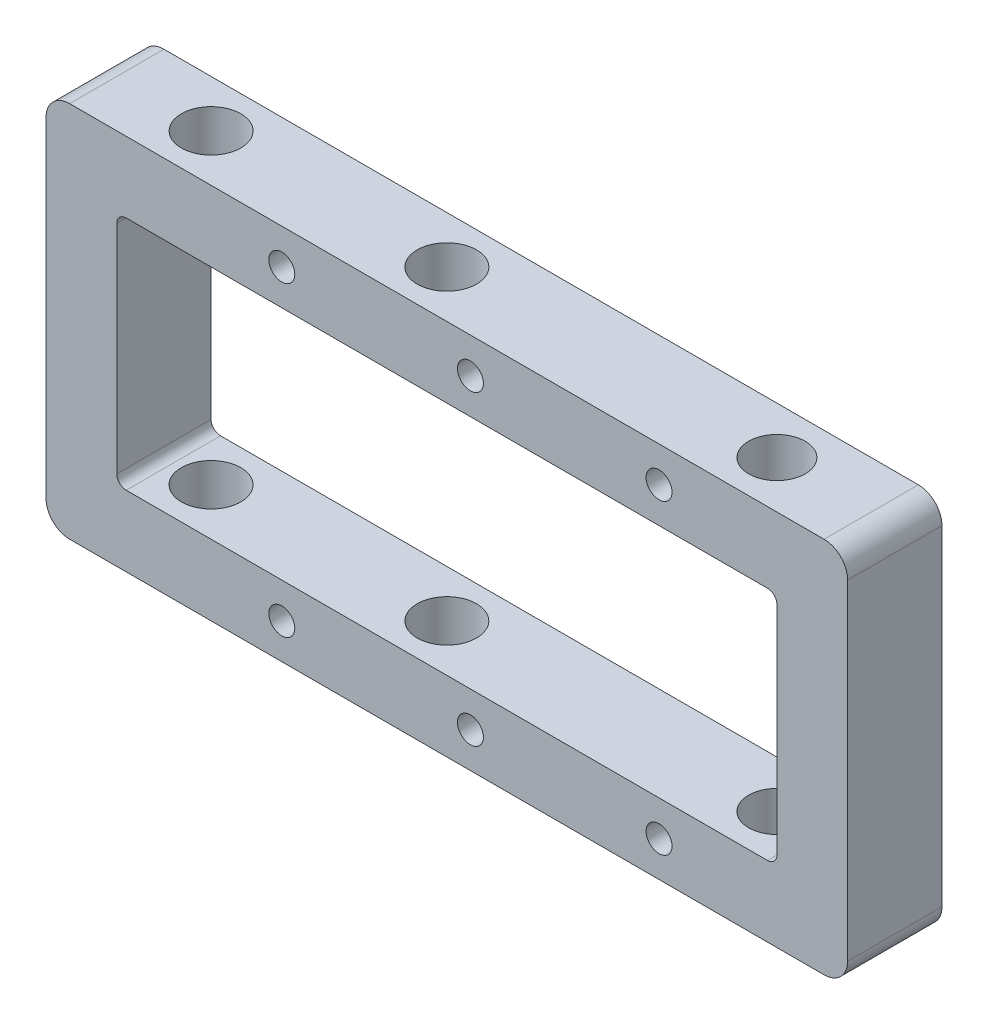
ISO-10303-21;
HEADER;
FILE_DESCRIPTION(('STEP AP214'),'2;1');
FILE_NAME('part.step','',(''),(''),'','','');
FILE_SCHEMA(('AUTOMOTIVE_DESIGN { 1 0 10303 214 1 1 1 1 }'));
ENDSEC;
DATA;
#1=APPLICATION_CONTEXT('core data for automotive mechanical design processes');
#2=APPLICATION_PROTOCOL_DEFINITION('international standard','automotive_design',2000,#1);
#3=PRODUCT_CONTEXT('',#1,'mechanical');
#4=PRODUCT('Part','Part','',(#3));
#5=PRODUCT_RELATED_PRODUCT_CATEGORY('part','',(#4));
#6=PRODUCT_DEFINITION_FORMATION('','',#4);
#7=PRODUCT_DEFINITION_CONTEXT('part definition',#1,'design');
#8=PRODUCT_DEFINITION('design','',#6,#7);
#9=PRODUCT_DEFINITION_SHAPE('','',#8);
#10=(LENGTH_UNIT() NAMED_UNIT(*) SI_UNIT(.MILLI.,.METRE.));
#11=(NAMED_UNIT(*) PLANE_ANGLE_UNIT() SI_UNIT($,.RADIAN.));
#12=(NAMED_UNIT(*) SI_UNIT($,.STERADIAN.) SOLID_ANGLE_UNIT());
#13=UNCERTAINTY_MEASURE_WITH_UNIT(LENGTH_MEASURE(1.E-05),#10,'distance_accuracy_value','');
#14=(GEOMETRIC_REPRESENTATION_CONTEXT(3) GLOBAL_UNCERTAINTY_ASSIGNED_CONTEXT((#13)) GLOBAL_UNIT_ASSIGNED_CONTEXT((#10,
#11,#12)) REPRESENTATION_CONTEXT('',''));
#15=CARTESIAN_POINT('',(0.,0.,0.));
#16=DIRECTION('',(0.,0.,1.));
#17=DIRECTION('',(1.,0.,0.));
#18=AXIS2_PLACEMENT_3D('',#15,#16,#17);
#19=CARTESIAN_POINT('',(0.,0.,20.));
#20=DIRECTION('',(0.,0.,1.));
#21=DIRECTION('',(1.,0.,0.));
#22=AXIS2_PLACEMENT_3D('',#19,#20,#21);
#23=PLANE('',#22);
#24=CARTESIAN_POINT('',(45.,32.5,20.));
#25=DIRECTION('',(0.,0.,-1.));
#26=DIRECTION('',(-1.,0.,0.));
#27=AXIS2_PLACEMENT_3D('',#24,#25,#26);
#28=CIRCLE('',#27,2.75);
#29=CARTESIAN_POINT('',(42.25,32.5,20.));
#30=VERTEX_POINT('',#29);
#31=EDGE_CURVE('E677',#30,#30,#28,.T.);
#32=ORIENTED_EDGE('',*,*,#31,.T.);
#33=EDGE_LOOP('',(#32));
#34=FACE_BOUND('',#33,.T.);
#35=CARTESIAN_POINT('',(45.,-32.5,20.));
#36=DIRECTION('',(0.,0.,-1.));
#37=DIRECTION('',(-1.,0.,0.));
#38=AXIS2_PLACEMENT_3D('',#35,#36,#37);
#39=CIRCLE('',#38,2.75);
#40=CARTESIAN_POINT('',(42.25,-32.5,20.));
#41=VERTEX_POINT('',#40);
#42=EDGE_CURVE('E683',#41,#41,#39,.T.);
#43=ORIENTED_EDGE('',*,*,#42,.T.);
#44=EDGE_LOOP('',(#43));
#45=FACE_BOUND('',#44,.T.);
#46=CARTESIAN_POINT('',(-35.,-32.5,20.));
#47=DIRECTION('',(0.,0.,1.));
#48=DIRECTION('',(1.,0.,0.));
#49=AXIS2_PLACEMENT_3D('',#46,#47,#48);
#50=CIRCLE('',#49,2.75);
#51=CARTESIAN_POINT('',(-32.25,-32.5,20.));
#52=VERTEX_POINT('',#51);
#53=EDGE_CURVE('E660',#52,#52,#50,.F.);
#54=ORIENTED_EDGE('',*,*,#53,.T.);
#55=EDGE_LOOP('',(#54));
#56=FACE_BOUND('',#55,.T.);
#57=CARTESIAN_POINT('',(4.99999999999999,32.5,20.));
#58=DIRECTION('',(0.,0.,1.));
#59=DIRECTION('',(1.,0.,0.));
#60=AXIS2_PLACEMENT_3D('',#57,#58,#59);
#61=CIRCLE('',#60,2.75);
#62=CARTESIAN_POINT('',(7.74999999999999,32.5,20.));
#63=VERTEX_POINT('',#62);
#64=EDGE_CURVE('E653',#63,#63,#61,.F.);
#65=ORIENTED_EDGE('',*,*,#64,.T.);
#66=EDGE_LOOP('',(#65));
#67=FACE_BOUND('',#66,.T.);
#68=CARTESIAN_POINT('',(4.99999999999999,-32.5,20.));
#69=DIRECTION('',(0.,0.,1.));
#70=DIRECTION('',(1.,0.,0.));
#71=AXIS2_PLACEMENT_3D('',#68,#69,#70);
#72=CIRCLE('',#71,2.75);
#73=CARTESIAN_POINT('',(7.74999999999999,-32.5,20.));
#74=VERTEX_POINT('',#73);
#75=EDGE_CURVE('E665',#74,#74,#72,.F.);
#76=ORIENTED_EDGE('',*,*,#75,.T.);
#77=EDGE_LOOP('',(#76));
#78=FACE_BOUND('',#77,.T.);
#79=CARTESIAN_POINT('',(-35.,32.5,20.));
#80=DIRECTION('',(0.,0.,1.));
#81=DIRECTION('',(1.,0.,0.));
#82=AXIS2_PLACEMENT_3D('',#79,#80,#81);
#83=CIRCLE('',#82,2.75);
#84=CARTESIAN_POINT('',(-32.25,32.5,20.));
#85=VERTEX_POINT('',#84);
#86=EDGE_CURVE('E292',#85,#85,#83,.F.);
#87=ORIENTED_EDGE('',*,*,#86,.T.);
#88=EDGE_LOOP('',(#87));
#89=FACE_BOUND('',#88,.T.);
#90=DIRECTION('',(-1.,0.,0.));
#91=VECTOR('',#90,1.);
#92=CARTESIAN_POINT('',(-85.,40.,20.));
#93=LINE('',#92,#91);
#94=CARTESIAN_POINT('',(80.,40.,20.));
#95=VERTEX_POINT('',#94);
#96=CARTESIAN_POINT('',(-80.,40.,20.));
#97=VERTEX_POINT('',#96);
#98=EDGE_CURVE('E255',#95,#97,#93,.T.);
#99=ORIENTED_EDGE('',*,*,#98,.T.);
#100=CARTESIAN_POINT('',(-80.,35.,20.));
#101=DIRECTION('',(0.,0.,1.));
#102=DIRECTION('',(1.,0.,0.));
#103=AXIS2_PLACEMENT_3D('',#100,#101,#102);
#104=CIRCLE('',#103,5.);
#105=CARTESIAN_POINT('',(-85.,35.,20.));
#106=VERTEX_POINT('',#105);
#107=EDGE_CURVE('E233',#97,#106,#104,.T.);
#108=ORIENTED_EDGE('',*,*,#107,.T.);
#109=DIRECTION('',(0.,-1.,0.));
#110=VECTOR('',#109,1.);
#111=CARTESIAN_POINT('',(-85.,40.,20.));
#112=LINE('',#111,#110);
#113=CARTESIAN_POINT('',(-85.,-35.,20.));
#114=VERTEX_POINT('',#113);
#115=EDGE_CURVE('E179',#106,#114,#112,.T.);
#116=ORIENTED_EDGE('',*,*,#115,.T.);
#117=CARTESIAN_POINT('',(-80.,-35.,20.));
#118=DIRECTION('',(0.,0.,1.));
#119=DIRECTION('',(1.,0.,0.));
#120=AXIS2_PLACEMENT_3D('',#117,#118,#119);
#121=CIRCLE('',#120,5.);
#122=CARTESIAN_POINT('',(-80.,-40.,20.));
#123=VERTEX_POINT('',#122);
#124=EDGE_CURVE('E56',#114,#123,#121,.T.);
#125=ORIENTED_EDGE('',*,*,#124,.T.);
#126=DIRECTION('',(1.,0.,0.));
#127=VECTOR('',#126,1.);
#128=CARTESIAN_POINT('',(-85.,-40.,20.));
#129=LINE('',#128,#127);
#130=CARTESIAN_POINT('',(80.,-40.,20.));
#131=VERTEX_POINT('',#130);
#132=EDGE_CURVE('E175',#123,#131,#129,.T.);
#133=ORIENTED_EDGE('',*,*,#132,.T.);
#134=CARTESIAN_POINT('',(80.,-35.,20.));
#135=DIRECTION('',(0.,0.,1.));
#136=DIRECTION('',(1.,0.,0.));
#137=AXIS2_PLACEMENT_3D('',#134,#135,#136);
#138=CIRCLE('',#137,5.);
#139=CARTESIAN_POINT('',(85.,-35.,20.));
#140=VERTEX_POINT('',#139);
#141=EDGE_CURVE('E230',#131,#140,#138,.T.);
#142=ORIENTED_EDGE('',*,*,#141,.T.);
#143=DIRECTION('',(0.,1.,0.));
#144=VECTOR('',#143,1.);
#145=CARTESIAN_POINT('',(85.,40.,20.));
#146=LINE('',#145,#144);
#147=CARTESIAN_POINT('',(85.,35.,20.));
#148=VERTEX_POINT('',#147);
#149=EDGE_CURVE('E245',#140,#148,#146,.T.);
#150=ORIENTED_EDGE('',*,*,#149,.T.);
#151=CARTESIAN_POINT('',(80.,35.,20.));
#152=DIRECTION('',(0.,0.,1.));
#153=DIRECTION('',(1.,0.,0.));
#154=AXIS2_PLACEMENT_3D('',#151,#152,#153);
#155=CIRCLE('',#154,5.);
#156=EDGE_CURVE('E228',#148,#95,#155,.T.);
#157=ORIENTED_EDGE('',*,*,#156,.T.);
#158=EDGE_LOOP('',(#99,#108,#116,#125,#133,#142,#150,#157));
#159=FACE_BOUND('',#158,.T.);
#160=DIRECTION('',(-1.,0.,0.));
#161=VECTOR('',#160,1.);
#162=CARTESIAN_POINT('',(-70.,25.,20.));
#163=LINE('',#162,#161);
#164=CARTESIAN_POINT('',(68.,25.,20.));
#165=VERTEX_POINT('',#164);
#166=CARTESIAN_POINT('',(-68.,25.,20.));
#167=VERTEX_POINT('',#166);
#168=EDGE_CURVE('E306',#165,#167,#163,.T.);
#169=ORIENTED_EDGE('',*,*,#168,.F.);
#170=CARTESIAN_POINT('',(68.,23.,20.));
#171=DIRECTION('',(0.,0.,1.));
#172=DIRECTION('',(1.,0.,0.));
#173=AXIS2_PLACEMENT_3D('',#170,#171,#172);
#174=CIRCLE('',#173,2.);
#175=CARTESIAN_POINT('',(70.,23.,20.));
#176=VERTEX_POINT('',#175);
#177=EDGE_CURVE('E160',#165,#176,#174,.F.);
#178=ORIENTED_EDGE('',*,*,#177,.T.);
#179=DIRECTION('',(0.,1.,0.));
#180=VECTOR('',#179,1.);
#181=CARTESIAN_POINT('',(70.,25.,20.));
#182=LINE('',#181,#180);
#183=CARTESIAN_POINT('',(70.,-23.,20.));
#184=VERTEX_POINT('',#183);
#185=EDGE_CURVE('E303',#184,#176,#182,.T.);
#186=ORIENTED_EDGE('',*,*,#185,.F.);
#187=CARTESIAN_POINT('',(68.,-23.,20.));
#188=DIRECTION('',(0.,0.,1.));
#189=DIRECTION('',(1.,0.,0.));
#190=AXIS2_PLACEMENT_3D('',#187,#188,#189);
#191=CIRCLE('',#190,2.);
#192=CARTESIAN_POINT('',(68.,-25.,20.));
#193=VERTEX_POINT('',#192);
#194=EDGE_CURVE('E161',#184,#193,#191,.F.);
#195=ORIENTED_EDGE('',*,*,#194,.T.);
#196=DIRECTION('',(1.,0.,0.));
#197=VECTOR('',#196,1.);
#198=CARTESIAN_POINT('',(-70.,-25.,20.));
#199=LINE('',#198,#197);
#200=CARTESIAN_POINT('',(-68.,-25.,20.));
#201=VERTEX_POINT('',#200);
#202=EDGE_CURVE('E271',#201,#193,#199,.T.);
#203=ORIENTED_EDGE('',*,*,#202,.F.);
#204=CARTESIAN_POINT('',(-68.,-23.,20.));
#205=DIRECTION('',(0.,0.,1.));
#206=DIRECTION('',(1.,0.,0.));
#207=AXIS2_PLACEMENT_3D('',#204,#205,#206);
#208=CIRCLE('',#207,2.);
#209=CARTESIAN_POINT('',(-70.,-23.,20.));
#210=VERTEX_POINT('',#209);
#211=EDGE_CURVE('E204',#201,#210,#208,.F.);
#212=ORIENTED_EDGE('',*,*,#211,.T.);
#213=DIRECTION('',(0.,-1.,0.));
#214=VECTOR('',#213,1.);
#215=CARTESIAN_POINT('',(-70.,25.,20.));
#216=LINE('',#215,#214);
#217=CARTESIAN_POINT('',(-70.,23.,20.));
#218=VERTEX_POINT('',#217);
#219=EDGE_CURVE('E309',#218,#210,#216,.T.);
#220=ORIENTED_EDGE('',*,*,#219,.F.);
#221=CARTESIAN_POINT('',(-68.,23.,20.));
#222=DIRECTION('',(0.,0.,1.));
#223=DIRECTION('',(1.,0.,0.));
#224=AXIS2_PLACEMENT_3D('',#221,#222,#223);
#225=CIRCLE('',#224,2.);
#226=EDGE_CURVE('E200',#218,#167,#225,.F.);
#227=ORIENTED_EDGE('',*,*,#226,.T.);
#228=EDGE_LOOP('',(#169,#178,#186,#195,#203,#212,#220,#227));
#229=FACE_BOUND('',#228,.T.);
#230=ADVANCED_FACE('F33',(#34,#45,#56,#67,#78,#89,#159,#229),#23,.T.);
#231=CARTESIAN_POINT('',(0.,0.,0.));
#232=DIRECTION('',(0.,0.,1.));
#233=DIRECTION('',(1.,0.,0.));
#234=AXIS2_PLACEMENT_3D('',#231,#232,#233);
#235=PLANE('',#234);
#236=CARTESIAN_POINT('',(45.,32.5,0.));
#237=DIRECTION('',(0.,0.,-1.));
#238=DIRECTION('',(-1.,0.,0.));
#239=AXIS2_PLACEMENT_3D('',#236,#237,#238);
#240=CIRCLE('',#239,2.75);
#241=CARTESIAN_POINT('',(42.25,32.5,0.));
#242=VERTEX_POINT('',#241);
#243=EDGE_CURVE('E686',#242,#242,#240,.T.);
#244=ORIENTED_EDGE('',*,*,#243,.F.);
#245=EDGE_LOOP('',(#244));
#246=FACE_BOUND('',#245,.T.);
#247=CARTESIAN_POINT('',(45.,-32.5,0.));
#248=DIRECTION('',(0.,0.,-1.));
#249=DIRECTION('',(-1.,0.,0.));
#250=AXIS2_PLACEMENT_3D('',#247,#248,#249);
#251=CIRCLE('',#250,2.75);
#252=CARTESIAN_POINT('',(42.25,-32.5,0.));
#253=VERTEX_POINT('',#252);
#254=EDGE_CURVE('E680',#253,#253,#251,.T.);
#255=ORIENTED_EDGE('',*,*,#254,.F.);
#256=EDGE_LOOP('',(#255));
#257=FACE_BOUND('',#256,.T.);
#258=CARTESIAN_POINT('',(-35.,-32.5,0.));
#259=DIRECTION('',(0.,0.,-1.));
#260=DIRECTION('',(-1.,0.,0.));
#261=AXIS2_PLACEMENT_3D('',#258,#259,#260);
#262=CIRCLE('',#261,2.75);
#263=CARTESIAN_POINT('',(-37.75,-32.5,0.));
#264=VERTEX_POINT('',#263);
#265=EDGE_CURVE('E651',#264,#264,#262,.T.);
#266=ORIENTED_EDGE('',*,*,#265,.F.);
#267=EDGE_LOOP('',(#266));
#268=FACE_BOUND('',#267,.T.);
#269=CARTESIAN_POINT('',(4.99999999999999,32.5,0.));
#270=DIRECTION('',(0.,0.,-1.));
#271=DIRECTION('',(-1.,0.,0.));
#272=AXIS2_PLACEMENT_3D('',#269,#270,#271);
#273=CIRCLE('',#272,2.75);
#274=CARTESIAN_POINT('',(2.24999999999999,32.5,0.));
#275=VERTEX_POINT('',#274);
#276=EDGE_CURVE('E656',#275,#275,#273,.T.);
#277=ORIENTED_EDGE('',*,*,#276,.F.);
#278=EDGE_LOOP('',(#277));
#279=FACE_BOUND('',#278,.T.);
#280=CARTESIAN_POINT('',(4.99999999999999,-32.5,0.));
#281=DIRECTION('',(0.,0.,-1.));
#282=DIRECTION('',(-1.,0.,0.));
#283=AXIS2_PLACEMENT_3D('',#280,#281,#282);
#284=CIRCLE('',#283,2.75);
#285=CARTESIAN_POINT('',(2.24999999999999,-32.5,0.));
#286=VERTEX_POINT('',#285);
#287=EDGE_CURVE('E657',#286,#286,#284,.T.);
#288=ORIENTED_EDGE('',*,*,#287,.F.);
#289=EDGE_LOOP('',(#288));
#290=FACE_BOUND('',#289,.T.);
#291=CARTESIAN_POINT('',(-35.,32.5,0.));
#292=DIRECTION('',(0.,0.,-1.));
#293=DIRECTION('',(-1.,0.,0.));
#294=AXIS2_PLACEMENT_3D('',#291,#292,#293);
#295=CIRCLE('',#294,2.75);
#296=CARTESIAN_POINT('',(-37.75,32.5,0.));
#297=VERTEX_POINT('',#296);
#298=EDGE_CURVE('E289',#297,#297,#295,.T.);
#299=ORIENTED_EDGE('',*,*,#298,.F.);
#300=EDGE_LOOP('',(#299));
#301=FACE_BOUND('',#300,.T.);
#302=DIRECTION('',(0.,-1.,0.));
#303=VECTOR('',#302,1.);
#304=CARTESIAN_POINT('',(-85.,40.,0.));
#305=LINE('',#304,#303);
#306=CARTESIAN_POINT('',(-85.,35.,0.));
#307=VERTEX_POINT('',#306);
#308=CARTESIAN_POINT('',(-85.,-35.,0.));
#309=VERTEX_POINT('',#308);
#310=EDGE_CURVE('E267',#307,#309,#305,.T.);
#311=ORIENTED_EDGE('',*,*,#310,.F.);
#312=CARTESIAN_POINT('',(-80.,35.,0.));
#313=DIRECTION('',(0.,0.,1.));
#314=DIRECTION('',(1.,0.,0.));
#315=AXIS2_PLACEMENT_3D('',#312,#313,#314);
#316=CIRCLE('',#315,5.);
#317=CARTESIAN_POINT('',(-80.,40.,0.));
#318=VERTEX_POINT('',#317);
#319=EDGE_CURVE('E221',#307,#318,#316,.F.);
#320=ORIENTED_EDGE('',*,*,#319,.T.);
#321=DIRECTION('',(-1.,0.,0.));
#322=VECTOR('',#321,1.);
#323=CARTESIAN_POINT('',(-85.,40.,0.));
#324=LINE('',#323,#322);
#325=CARTESIAN_POINT('',(80.,40.,0.));
#326=VERTEX_POINT('',#325);
#327=EDGE_CURVE('E263',#326,#318,#324,.T.);
#328=ORIENTED_EDGE('',*,*,#327,.F.);
#329=CARTESIAN_POINT('',(80.,35.,0.));
#330=DIRECTION('',(0.,0.,1.));
#331=DIRECTION('',(1.,0.,0.));
#332=AXIS2_PLACEMENT_3D('',#329,#330,#331);
#333=CIRCLE('',#332,5.);
#334=CARTESIAN_POINT('',(85.,35.,0.));
#335=VERTEX_POINT('',#334);
#336=EDGE_CURVE('E215',#326,#335,#333,.F.);
#337=ORIENTED_EDGE('',*,*,#336,.T.);
#338=DIRECTION('',(0.,1.,0.));
#339=VECTOR('',#338,1.);
#340=CARTESIAN_POINT('',(85.,40.,0.));
#341=LINE('',#340,#339);
#342=CARTESIAN_POINT('',(85.,-35.,0.));
#343=VERTEX_POINT('',#342);
#344=EDGE_CURVE('E248',#343,#335,#341,.T.);
#345=ORIENTED_EDGE('',*,*,#344,.F.);
#346=CARTESIAN_POINT('',(80.,-35.,0.));
#347=DIRECTION('',(0.,0.,1.));
#348=DIRECTION('',(1.,0.,0.));
#349=AXIS2_PLACEMENT_3D('',#346,#347,#348);
#350=CIRCLE('',#349,5.);
#351=CARTESIAN_POINT('',(80.,-40.,0.));
#352=VERTEX_POINT('',#351);
#353=EDGE_CURVE('E217',#343,#352,#350,.F.);
#354=ORIENTED_EDGE('',*,*,#353,.T.);
#355=DIRECTION('',(1.,0.,0.));
#356=VECTOR('',#355,1.);
#357=CARTESIAN_POINT('',(-85.,-40.,0.));
#358=LINE('',#357,#356);
#359=CARTESIAN_POINT('',(-80.,-40.,0.));
#360=VERTEX_POINT('',#359);
#361=EDGE_CURVE('E256',#360,#352,#358,.T.);
#362=ORIENTED_EDGE('',*,*,#361,.F.);
#363=CARTESIAN_POINT('',(-80.,-35.,0.));
#364=DIRECTION('',(0.,0.,1.));
#365=DIRECTION('',(1.,0.,0.));
#366=AXIS2_PLACEMENT_3D('',#363,#364,#365);
#367=CIRCLE('',#366,5.);
#368=EDGE_CURVE('E219',#360,#309,#367,.F.);
#369=ORIENTED_EDGE('',*,*,#368,.T.);
#370=EDGE_LOOP('',(#311,#320,#328,#337,#345,#354,#362,#369));
#371=FACE_BOUND('',#370,.T.);
#372=DIRECTION('',(1.,0.,0.));
#373=VECTOR('',#372,1.);
#374=CARTESIAN_POINT('',(-70.,-25.,0.));
#375=LINE('',#374,#373);
#376=CARTESIAN_POINT('',(-68.,-25.,0.));
#377=VERTEX_POINT('',#376);
#378=CARTESIAN_POINT('',(68.,-25.,0.));
#379=VERTEX_POINT('',#378);
#380=EDGE_CURVE('E307',#377,#379,#375,.T.);
#381=ORIENTED_EDGE('',*,*,#380,.T.);
#382=CARTESIAN_POINT('',(68.,-23.,0.));
#383=DIRECTION('',(0.,0.,1.));
#384=DIRECTION('',(1.,0.,0.));
#385=AXIS2_PLACEMENT_3D('',#382,#383,#384);
#386=CIRCLE('',#385,2.);
#387=CARTESIAN_POINT('',(70.,-23.,0.));
#388=VERTEX_POINT('',#387);
#389=EDGE_CURVE('E206',#379,#388,#386,.T.);
#390=ORIENTED_EDGE('',*,*,#389,.T.);
#391=DIRECTION('',(0.,1.,0.));
#392=VECTOR('',#391,1.);
#393=CARTESIAN_POINT('',(70.,25.,0.));
#394=LINE('',#393,#392);
#395=CARTESIAN_POINT('',(70.,23.,0.));
#396=VERTEX_POINT('',#395);
#397=EDGE_CURVE('E155',#388,#396,#394,.T.);
#398=ORIENTED_EDGE('',*,*,#397,.T.);
#399=CARTESIAN_POINT('',(68.,23.,0.));
#400=DIRECTION('',(0.,0.,1.));
#401=DIRECTION('',(1.,0.,0.));
#402=AXIS2_PLACEMENT_3D('',#399,#400,#401);
#403=CIRCLE('',#402,2.);
#404=CARTESIAN_POINT('',(68.,25.,0.));
#405=VERTEX_POINT('',#404);
#406=EDGE_CURVE('E149',#396,#405,#403,.T.);
#407=ORIENTED_EDGE('',*,*,#406,.T.);
#408=DIRECTION('',(-1.,0.,0.));
#409=VECTOR('',#408,1.);
#410=CARTESIAN_POINT('',(-70.,25.,0.));
#411=LINE('',#410,#409);
#412=CARTESIAN_POINT('',(-68.,25.,0.));
#413=VERTEX_POINT('',#412);
#414=EDGE_CURVE('E153',#405,#413,#411,.T.);
#415=ORIENTED_EDGE('',*,*,#414,.T.);
#416=CARTESIAN_POINT('',(-68.,23.,0.));
#417=DIRECTION('',(0.,0.,1.));
#418=DIRECTION('',(1.,0.,0.));
#419=AXIS2_PLACEMENT_3D('',#416,#417,#418);
#420=CIRCLE('',#419,2.);
#421=CARTESIAN_POINT('',(-70.,23.,0.));
#422=VERTEX_POINT('',#421);
#423=EDGE_CURVE('E198',#413,#422,#420,.T.);
#424=ORIENTED_EDGE('',*,*,#423,.T.);
#425=DIRECTION('',(0.,-1.,0.));
#426=VECTOR('',#425,1.);
#427=CARTESIAN_POINT('',(-70.,25.,0.));
#428=LINE('',#427,#426);
#429=CARTESIAN_POINT('',(-70.,-23.,0.));
#430=VERTEX_POINT('',#429);
#431=EDGE_CURVE('E171',#422,#430,#428,.T.);
#432=ORIENTED_EDGE('',*,*,#431,.T.);
#433=CARTESIAN_POINT('',(-68.,-23.,0.));
#434=DIRECTION('',(0.,0.,1.));
#435=DIRECTION('',(1.,0.,0.));
#436=AXIS2_PLACEMENT_3D('',#433,#434,#435);
#437=CIRCLE('',#436,2.);
#438=EDGE_CURVE('E202',#430,#377,#437,.T.);
#439=ORIENTED_EDGE('',*,*,#438,.T.);
#440=EDGE_LOOP('',(#381,#390,#398,#407,#415,#424,#432,#439));
#441=FACE_BOUND('',#440,.T.);
#442=ADVANCED_FACE('F152',(#246,#257,#268,#279,#290,#301,#371,#441),#235,.F.);
#443=CARTESIAN_POINT('',(85.,40.,20.));
#444=DIRECTION('',(-1.,0.,0.));
#445=DIRECTION('',(0.,0.,1.));
#446=AXIS2_PLACEMENT_3D('',#443,#444,#445);
#447=PLANE('',#446);
#448=ORIENTED_EDGE('',*,*,#149,.F.);
#449=DIRECTION('',(0.,0.,-1.));
#450=VECTOR('',#449,1.);
#451=CARTESIAN_POINT('',(85.,-35.,20.));
#452=LINE('',#451,#450);
#453=EDGE_CURVE('E11',#140,#343,#452,.T.);
#454=ORIENTED_EDGE('',*,*,#453,.T.);
#455=ORIENTED_EDGE('',*,*,#344,.T.);
#456=DIRECTION('',(0.,0.,-1.));
#457=VECTOR('',#456,1.);
#458=CARTESIAN_POINT('',(85.,35.,20.));
#459=LINE('',#458,#457);
#460=EDGE_CURVE('E42',#335,#148,#459,.F.);
#461=ORIENTED_EDGE('',*,*,#460,.T.);
#462=EDGE_LOOP('',(#448,#454,#455,#461));
#463=FACE_BOUND('',#462,.T.);
#464=ADVANCED_FACE('F244',(#463),#447,.F.);
#465=CARTESIAN_POINT('',(-85.,40.,20.));
#466=DIRECTION('',(0.,-1.,0.));
#467=DIRECTION('',(0.,0.,-1.));
#468=AXIS2_PLACEMENT_3D('',#465,#466,#467);
#469=PLANE('',#468);
#470=CARTESIAN_POINT('',(60.,40.,10.));
#471=DIRECTION('',(0.,1.,0.));
#472=DIRECTION('',(0.,0.,1.));
#473=AXIS2_PLACEMENT_3D('',#470,#471,#472);
#474=CIRCLE('',#473,5.99999999999998);
#475=CARTESIAN_POINT('',(60.,40.,16.));
#476=VERTEX_POINT('',#475);
#477=EDGE_CURVE('E673',#476,#476,#474,.T.);
#478=ORIENTED_EDGE('',*,*,#477,.F.);
#479=EDGE_LOOP('',(#478));
#480=FACE_BOUND('',#479,.T.);
#481=CARTESIAN_POINT('',(-60.,40.,10.));
#482=DIRECTION('',(0.,-1.,0.));
#483=DIRECTION('',(0.,0.,-1.));
#484=AXIS2_PLACEMENT_3D('',#481,#482,#483);
#485=CIRCLE('',#484,6.3);
#486=CARTESIAN_POINT('',(-60.,40.,3.7));
#487=VERTEX_POINT('',#486);
#488=EDGE_CURVE('E300',#487,#487,#485,.T.);
#489=ORIENTED_EDGE('',*,*,#488,.T.);
#490=EDGE_LOOP('',(#489));
#491=FACE_BOUND('',#490,.T.);
#492=CARTESIAN_POINT('',(-10.,40.,10.));
#493=DIRECTION('',(0.,-1.,0.));
#494=DIRECTION('',(0.,0.,-1.));
#495=AXIS2_PLACEMENT_3D('',#492,#493,#494);
#496=CIRCLE('',#495,6.3);
#497=CARTESIAN_POINT('',(-10.,40.,3.7));
#498=VERTEX_POINT('',#497);
#499=EDGE_CURVE('E281',#498,#498,#496,.T.);
#500=ORIENTED_EDGE('',*,*,#499,.T.);
#501=EDGE_LOOP('',(#500));
#502=FACE_BOUND('',#501,.T.);
#503=ORIENTED_EDGE('',*,*,#327,.T.);
#504=DIRECTION('',(0.,0.,-1.));
#505=VECTOR('',#504,1.);
#506=CARTESIAN_POINT('',(-80.,40.,20.));
#507=LINE('',#506,#505);
#508=EDGE_CURVE('E226',#318,#97,#507,.F.);
#509=ORIENTED_EDGE('',*,*,#508,.T.);
#510=ORIENTED_EDGE('',*,*,#98,.F.);
#511=DIRECTION('',(0.,0.,-1.));
#512=VECTOR('',#511,1.);
#513=CARTESIAN_POINT('',(80.,40.,20.));
#514=LINE('',#513,#512);
#515=EDGE_CURVE('E223',#95,#326,#514,.T.);
#516=ORIENTED_EDGE('',*,*,#515,.T.);
#517=EDGE_LOOP('',(#503,#509,#510,#516));
#518=FACE_BOUND('',#517,.T.);
#519=ADVANCED_FACE('F262',(#480,#491,#502,#518),#469,.F.);
#520=CARTESIAN_POINT('',(-85.,40.,20.));
#521=DIRECTION('',(1.,0.,0.));
#522=DIRECTION('',(0.,0.,-1.));
#523=AXIS2_PLACEMENT_3D('',#520,#521,#522);
#524=PLANE('',#523);
#525=ORIENTED_EDGE('',*,*,#115,.F.);
#526=DIRECTION('',(0.,0.,-1.));
#527=VECTOR('',#526,1.);
#528=CARTESIAN_POINT('',(-85.,35.,20.));
#529=LINE('',#528,#527);
#530=EDGE_CURVE('E212',#106,#307,#529,.T.);
#531=ORIENTED_EDGE('',*,*,#530,.T.);
#532=ORIENTED_EDGE('',*,*,#310,.T.);
#533=DIRECTION('',(0.,0.,-1.));
#534=VECTOR('',#533,1.);
#535=CARTESIAN_POINT('',(-85.,-35.,20.));
#536=LINE('',#535,#534);
#537=EDGE_CURVE('E210',#309,#114,#536,.F.);
#538=ORIENTED_EDGE('',*,*,#537,.T.);
#539=EDGE_LOOP('',(#525,#531,#532,#538));
#540=FACE_BOUND('',#539,.T.);
#541=ADVANCED_FACE('F355',(#540),#524,.F.);
#542=CARTESIAN_POINT('',(-85.,-40.,20.));
#543=DIRECTION('',(0.,1.,0.));
#544=DIRECTION('',(0.,0.,1.));
#545=AXIS2_PLACEMENT_3D('',#542,#543,#544);
#546=PLANE('',#545);
#547=CARTESIAN_POINT('',(60.,-40.,10.));
#548=DIRECTION('',(0.,1.,0.));
#549=DIRECTION('',(0.,0.,1.));
#550=AXIS2_PLACEMENT_3D('',#547,#548,#549);
#551=CIRCLE('',#550,5.99999999999998);
#552=CARTESIAN_POINT('',(60.,-40.,16.));
#553=VERTEX_POINT('',#552);
#554=EDGE_CURVE('E676',#553,#553,#551,.T.);
#555=ORIENTED_EDGE('',*,*,#554,.T.);
#556=EDGE_LOOP('',(#555));
#557=FACE_BOUND('',#556,.T.);
#558=CARTESIAN_POINT('',(-60.,-40.,10.));
#559=DIRECTION('',(0.,1.,0.));
#560=DIRECTION('',(0.,0.,1.));
#561=AXIS2_PLACEMENT_3D('',#558,#559,#560);
#562=CIRCLE('',#561,6.3);
#563=CARTESIAN_POINT('',(-60.,-40.,16.3));
#564=VERTEX_POINT('',#563);
#565=EDGE_CURVE('E277',#564,#564,#562,.T.);
#566=ORIENTED_EDGE('',*,*,#565,.T.);
#567=EDGE_LOOP('',(#566));
#568=FACE_BOUND('',#567,.T.);
#569=CARTESIAN_POINT('',(-10.,-40.,10.));
#570=DIRECTION('',(0.,1.,0.));
#571=DIRECTION('',(0.,0.,1.));
#572=AXIS2_PLACEMENT_3D('',#569,#570,#571);
#573=CIRCLE('',#572,6.3);
#574=CARTESIAN_POINT('',(-10.,-40.,16.3));
#575=VERTEX_POINT('',#574);
#576=EDGE_CURVE('E284',#575,#575,#573,.T.);
#577=ORIENTED_EDGE('',*,*,#576,.T.);
#578=EDGE_LOOP('',(#577));
#579=FACE_BOUND('',#578,.T.);
#580=ORIENTED_EDGE('',*,*,#132,.F.);
#581=DIRECTION('',(0.,0.,-1.));
#582=VECTOR('',#581,1.);
#583=CARTESIAN_POINT('',(-80.,-40.,20.));
#584=LINE('',#583,#582);
#585=EDGE_CURVE('E236',#123,#360,#584,.T.);
#586=ORIENTED_EDGE('',*,*,#585,.T.);
#587=ORIENTED_EDGE('',*,*,#361,.T.);
#588=DIRECTION('',(0.,0.,-1.));
#589=VECTOR('',#588,1.);
#590=CARTESIAN_POINT('',(80.,-40.,20.));
#591=LINE('',#590,#589);
#592=EDGE_CURVE('E49',#352,#131,#591,.F.);
#593=ORIENTED_EDGE('',*,*,#592,.T.);
#594=EDGE_LOOP('',(#580,#586,#587,#593));
#595=FACE_BOUND('',#594,.T.);
#596=ADVANCED_FACE('F328',(#557,#568,#579,#595),#546,.F.);
#597=CARTESIAN_POINT('',(70.,25.,20.));
#598=DIRECTION('',(-1.,0.,0.));
#599=DIRECTION('',(0.,0.,1.));
#600=AXIS2_PLACEMENT_3D('',#597,#598,#599);
#601=PLANE('',#600);
#602=ORIENTED_EDGE('',*,*,#397,.F.);
#603=DIRECTION('',(0.,0.,-1.));
#604=VECTOR('',#603,1.);
#605=CARTESIAN_POINT('',(70.,-23.,20.));
#606=LINE('',#605,#604);
#607=EDGE_CURVE('E196',#388,#184,#606,.F.);
#608=ORIENTED_EDGE('',*,*,#607,.T.);
#609=ORIENTED_EDGE('',*,*,#185,.T.);
#610=DIRECTION('',(0.,0.,-1.));
#611=VECTOR('',#610,1.);
#612=CARTESIAN_POINT('',(70.,23.,0.));
#613=LINE('',#612,#611);
#614=EDGE_CURVE('E194',#176,#396,#613,.T.);
#615=ORIENTED_EDGE('',*,*,#614,.T.);
#616=EDGE_LOOP('',(#602,#608,#609,#615));
#617=FACE_BOUND('',#616,.T.);
#618=ADVANCED_FACE('F350',(#617),#601,.T.);
#619=CARTESIAN_POINT('',(-70.,25.,20.));
#620=DIRECTION('',(0.,-1.,0.));
#621=DIRECTION('',(0.,0.,-1.));
#622=AXIS2_PLACEMENT_3D('',#619,#620,#621);
#623=PLANE('',#622);
#624=CARTESIAN_POINT('',(60.,25.,10.));
#625=DIRECTION('',(0.,-1.,0.));
#626=DIRECTION('',(0.,0.,-1.));
#627=AXIS2_PLACEMENT_3D('',#624,#625,#626);
#628=CIRCLE('',#627,5.99999999999998);
#629=CARTESIAN_POINT('',(60.,25.,4.00000000000002));
#630=VERTEX_POINT('',#629);
#631=EDGE_CURVE('E668',#630,#630,#628,.T.);
#632=ORIENTED_EDGE('',*,*,#631,.F.);
#633=EDGE_LOOP('',(#632));
#634=FACE_BOUND('',#633,.T.);
#635=CARTESIAN_POINT('',(-60.,25.,10.));
#636=DIRECTION('',(0.,-1.,0.));
#637=DIRECTION('',(0.,0.,-1.));
#638=AXIS2_PLACEMENT_3D('',#635,#636,#637);
#639=CIRCLE('',#638,6.3);
#640=CARTESIAN_POINT('',(-60.,25.,3.7));
#641=VERTEX_POINT('',#640);
#642=EDGE_CURVE('E297',#641,#641,#639,.T.);
#643=ORIENTED_EDGE('',*,*,#642,.F.);
#644=EDGE_LOOP('',(#643));
#645=FACE_BOUND('',#644,.T.);
#646=CARTESIAN_POINT('',(-10.,25.,10.));
#647=DIRECTION('',(0.,-1.,0.));
#648=DIRECTION('',(0.,0.,-1.));
#649=AXIS2_PLACEMENT_3D('',#646,#647,#648);
#650=CIRCLE('',#649,6.3);
#651=CARTESIAN_POINT('',(-10.,25.,3.7));
#652=VERTEX_POINT('',#651);
#653=EDGE_CURVE('E276',#652,#652,#650,.T.);
#654=ORIENTED_EDGE('',*,*,#653,.F.);
#655=EDGE_LOOP('',(#654));
#656=FACE_BOUND('',#655,.T.);
#657=ORIENTED_EDGE('',*,*,#168,.T.);
#658=DIRECTION('',(0.,0.,-1.));
#659=VECTOR('',#658,1.);
#660=CARTESIAN_POINT('',(-68.,25.,0.));
#661=LINE('',#660,#659);
#662=EDGE_CURVE('E170',#167,#413,#661,.T.);
#663=ORIENTED_EDGE('',*,*,#662,.T.);
#664=ORIENTED_EDGE('',*,*,#414,.F.);
#665=DIRECTION('',(0.,0.,-1.));
#666=VECTOR('',#665,1.);
#667=CARTESIAN_POINT('',(68.,25.,20.));
#668=LINE('',#667,#666);
#669=EDGE_CURVE('E167',#405,#165,#668,.F.);
#670=ORIENTED_EDGE('',*,*,#669,.T.);
#671=EDGE_LOOP('',(#657,#663,#664,#670));
#672=FACE_BOUND('',#671,.T.);
#673=ADVANCED_FACE('F166',(#634,#645,#656,#672),#623,.T.);
#674=CARTESIAN_POINT('',(-70.,25.,20.));
#675=DIRECTION('',(1.,0.,0.));
#676=DIRECTION('',(0.,0.,-1.));
#677=AXIS2_PLACEMENT_3D('',#674,#675,#676);
#678=PLANE('',#677);
#679=ORIENTED_EDGE('',*,*,#431,.F.);
#680=DIRECTION('',(0.,0.,-1.));
#681=VECTOR('',#680,1.);
#682=CARTESIAN_POINT('',(-70.,23.,20.));
#683=LINE('',#682,#681);
#684=EDGE_CURVE('E187',#422,#218,#683,.F.);
#685=ORIENTED_EDGE('',*,*,#684,.T.);
#686=ORIENTED_EDGE('',*,*,#219,.T.);
#687=DIRECTION('',(0.,0.,-1.));
#688=VECTOR('',#687,1.);
#689=CARTESIAN_POINT('',(-70.,-23.,0.));
#690=LINE('',#689,#688);
#691=EDGE_CURVE('E177',#210,#430,#690,.T.);
#692=ORIENTED_EDGE('',*,*,#691,.T.);
#693=EDGE_LOOP('',(#679,#685,#686,#692));
#694=FACE_BOUND('',#693,.T.);
#695=ADVANCED_FACE('F427',(#694),#678,.T.);
#696=CARTESIAN_POINT('',(-70.,-25.,20.));
#697=DIRECTION('',(0.,1.,0.));
#698=DIRECTION('',(0.,0.,1.));
#699=AXIS2_PLACEMENT_3D('',#696,#697,#698);
#700=PLANE('',#699);
#701=CARTESIAN_POINT('',(60.,-25.,10.));
#702=DIRECTION('',(0.,1.,0.));
#703=DIRECTION('',(0.,0.,1.));
#704=AXIS2_PLACEMENT_3D('',#701,#702,#703);
#705=CIRCLE('',#704,5.99999999999998);
#706=CARTESIAN_POINT('',(60.,-25.,16.));
#707=VERTEX_POINT('',#706);
#708=EDGE_CURVE('E37',#707,#707,#705,.T.);
#709=ORIENTED_EDGE('',*,*,#708,.F.);
#710=EDGE_LOOP('',(#709));
#711=FACE_BOUND('',#710,.T.);
#712=CARTESIAN_POINT('',(-60.,-25.,10.));
#713=DIRECTION('',(0.,1.,0.));
#714=DIRECTION('',(0.,0.,1.));
#715=AXIS2_PLACEMENT_3D('',#712,#713,#714);
#716=CIRCLE('',#715,6.3);
#717=CARTESIAN_POINT('',(-60.,-25.,16.3));
#718=VERTEX_POINT('',#717);
#719=EDGE_CURVE('E182',#718,#718,#716,.T.);
#720=ORIENTED_EDGE('',*,*,#719,.F.);
#721=EDGE_LOOP('',(#720));
#722=FACE_BOUND('',#721,.T.);
#723=CARTESIAN_POINT('',(-10.,-25.,10.));
#724=DIRECTION('',(0.,1.,0.));
#725=DIRECTION('',(0.,0.,1.));
#726=AXIS2_PLACEMENT_3D('',#723,#724,#725);
#727=CIRCLE('',#726,6.3);
#728=CARTESIAN_POINT('',(-10.,-25.,16.3));
#729=VERTEX_POINT('',#728);
#730=EDGE_CURVE('E274',#729,#729,#727,.T.);
#731=ORIENTED_EDGE('',*,*,#730,.F.);
#732=EDGE_LOOP('',(#731));
#733=FACE_BOUND('',#732,.T.);
#734=ORIENTED_EDGE('',*,*,#380,.F.);
#735=DIRECTION('',(0.,0.,-1.));
#736=VECTOR('',#735,1.);
#737=CARTESIAN_POINT('',(-68.,-25.,20.));
#738=LINE('',#737,#736);
#739=EDGE_CURVE('E192',#377,#201,#738,.F.);
#740=ORIENTED_EDGE('',*,*,#739,.T.);
#741=ORIENTED_EDGE('',*,*,#202,.T.);
#742=DIRECTION('',(0.,0.,-1.));
#743=VECTOR('',#742,1.);
#744=CARTESIAN_POINT('',(68.,-25.,0.));
#745=LINE('',#744,#743);
#746=EDGE_CURVE('E189',#193,#379,#745,.T.);
#747=ORIENTED_EDGE('',*,*,#746,.T.);
#748=EDGE_LOOP('',(#734,#740,#741,#747));
#749=FACE_BOUND('',#748,.T.);
#750=ADVANCED_FACE('F434',(#711,#722,#733,#749),#700,.T.);
#751=CARTESIAN_POINT('',(-10.,-40.,10.));
#752=DIRECTION('',(0.,1.,0.));
#753=DIRECTION('',(0.,0.,1.));
#754=AXIS2_PLACEMENT_3D('',#751,#752,#753);
#755=CYLINDRICAL_SURFACE('',#754,6.3);
#756=ORIENTED_EDGE('',*,*,#730,.T.);
#757=EDGE_LOOP('',(#756));
#758=FACE_BOUND('',#757,.T.);
#759=ORIENTED_EDGE('',*,*,#576,.F.);
#760=EDGE_LOOP('',(#759));
#761=FACE_BOUND('',#760,.T.);
#762=ADVANCED_FACE('F439',(#758,#761),#755,.F.);
#763=CARTESIAN_POINT('',(-60.,-40.,10.));
#764=DIRECTION('',(0.,1.,0.));
#765=DIRECTION('',(0.,0.,1.));
#766=AXIS2_PLACEMENT_3D('',#763,#764,#765);
#767=CYLINDRICAL_SURFACE('',#766,6.3);
#768=ORIENTED_EDGE('',*,*,#719,.T.);
#769=EDGE_LOOP('',(#768));
#770=FACE_BOUND('',#769,.T.);
#771=ORIENTED_EDGE('',*,*,#565,.F.);
#772=EDGE_LOOP('',(#771));
#773=FACE_BOUND('',#772,.T.);
#774=ADVANCED_FACE('F511',(#770,#773),#767,.F.);
#775=ORIENTED_EDGE('',*,*,#653,.T.);
#776=EDGE_LOOP('',(#775));
#777=FACE_BOUND('',#776,.T.);
#778=ORIENTED_EDGE('',*,*,#499,.F.);
#779=EDGE_LOOP('',(#778));
#780=FACE_BOUND('',#779,.T.);
#781=ADVANCED_FACE('F514',(#777,#780),#755,.F.);
#782=ORIENTED_EDGE('',*,*,#642,.T.);
#783=EDGE_LOOP('',(#782));
#784=FACE_BOUND('',#783,.T.);
#785=ORIENTED_EDGE('',*,*,#488,.F.);
#786=EDGE_LOOP('',(#785));
#787=FACE_BOUND('',#786,.T.);
#788=ADVANCED_FACE('F509',(#784,#787),#767,.F.);
#789=CARTESIAN_POINT('',(-35.,32.5,20.001));
#790=DIRECTION('',(0.,0.,-1.));
#791=DIRECTION('',(-1.,0.,0.));
#792=AXIS2_PLACEMENT_3D('',#789,#790,#791);
#793=CYLINDRICAL_SURFACE('',#792,2.75);
#794=ORIENTED_EDGE('',*,*,#86,.F.);
#795=EDGE_LOOP('',(#794));
#796=FACE_BOUND('',#795,.T.);
#797=ORIENTED_EDGE('',*,*,#298,.T.);
#798=EDGE_LOOP('',(#797));
#799=FACE_BOUND('',#798,.T.);
#800=ADVANCED_FACE('F499',(#796,#799),#793,.F.);
#801=CARTESIAN_POINT('',(4.99999999999999,-32.5,20.001));
#802=DIRECTION('',(0.,0.,-1.));
#803=DIRECTION('',(-1.,0.,0.));
#804=AXIS2_PLACEMENT_3D('',#801,#802,#803);
#805=CYLINDRICAL_SURFACE('',#804,2.75);
#806=ORIENTED_EDGE('',*,*,#75,.F.);
#807=EDGE_LOOP('',(#806));
#808=FACE_BOUND('',#807,.T.);
#809=ORIENTED_EDGE('',*,*,#287,.T.);
#810=EDGE_LOOP('',(#809));
#811=FACE_BOUND('',#810,.T.);
#812=ADVANCED_FACE('F495',(#808,#811),#805,.F.);
#813=CARTESIAN_POINT('',(4.99999999999999,32.5,20.001));
#814=DIRECTION('',(0.,0.,-1.));
#815=DIRECTION('',(-1.,0.,0.));
#816=AXIS2_PLACEMENT_3D('',#813,#814,#815);
#817=CYLINDRICAL_SURFACE('',#816,2.75);
#818=ORIENTED_EDGE('',*,*,#64,.F.);
#819=EDGE_LOOP('',(#818));
#820=FACE_BOUND('',#819,.T.);
#821=ORIENTED_EDGE('',*,*,#276,.T.);
#822=EDGE_LOOP('',(#821));
#823=FACE_BOUND('',#822,.T.);
#824=ADVANCED_FACE('F498',(#820,#823),#817,.F.);
#825=CARTESIAN_POINT('',(-35.,-32.5,20.001));
#826=DIRECTION('',(0.,0.,-1.));
#827=DIRECTION('',(-1.,0.,0.));
#828=AXIS2_PLACEMENT_3D('',#825,#826,#827);
#829=CYLINDRICAL_SURFACE('',#828,2.75);
#830=ORIENTED_EDGE('',*,*,#53,.F.);
#831=EDGE_LOOP('',(#830));
#832=FACE_BOUND('',#831,.T.);
#833=ORIENTED_EDGE('',*,*,#265,.T.);
#834=EDGE_LOOP('',(#833));
#835=FACE_BOUND('',#834,.T.);
#836=ADVANCED_FACE('F368',(#832,#835),#829,.F.);
#837=CARTESIAN_POINT('',(-68.,23.,20.));
#838=DIRECTION('',(0.,0.,1.));
#839=DIRECTION('',(1.,0.,0.));
#840=AXIS2_PLACEMENT_3D('',#837,#838,#839);
#841=CYLINDRICAL_SURFACE('',#840,2.);
#842=ORIENTED_EDGE('',*,*,#226,.F.);
#843=ORIENTED_EDGE('',*,*,#684,.F.);
#844=ORIENTED_EDGE('',*,*,#423,.F.);
#845=ORIENTED_EDGE('',*,*,#662,.F.);
#846=EDGE_LOOP('',(#842,#843,#844,#845));
#847=FACE_BOUND('',#846,.T.);
#848=ADVANCED_FACE('F364',(#847),#841,.F.);
#849=CARTESIAN_POINT('',(-68.,-23.,20.));
#850=DIRECTION('',(0.,0.,1.));
#851=DIRECTION('',(1.,0.,0.));
#852=AXIS2_PLACEMENT_3D('',#849,#850,#851);
#853=CYLINDRICAL_SURFACE('',#852,2.);
#854=ORIENTED_EDGE('',*,*,#211,.F.);
#855=ORIENTED_EDGE('',*,*,#739,.F.);
#856=ORIENTED_EDGE('',*,*,#438,.F.);
#857=ORIENTED_EDGE('',*,*,#691,.F.);
#858=EDGE_LOOP('',(#854,#855,#856,#857));
#859=FACE_BOUND('',#858,.T.);
#860=ADVANCED_FACE('F367',(#859),#853,.F.);
#861=CARTESIAN_POINT('',(68.,-23.,20.));
#862=DIRECTION('',(0.,0.,1.));
#863=DIRECTION('',(1.,0.,0.));
#864=AXIS2_PLACEMENT_3D('',#861,#862,#863);
#865=CYLINDRICAL_SURFACE('',#864,2.);
#866=ORIENTED_EDGE('',*,*,#194,.F.);
#867=ORIENTED_EDGE('',*,*,#607,.F.);
#868=ORIENTED_EDGE('',*,*,#389,.F.);
#869=ORIENTED_EDGE('',*,*,#746,.F.);
#870=EDGE_LOOP('',(#866,#867,#868,#869));
#871=FACE_BOUND('',#870,.T.);
#872=ADVANCED_FACE('F372',(#871),#865,.F.);
#873=CARTESIAN_POINT('',(68.,23.,20.));
#874=DIRECTION('',(0.,0.,1.));
#875=DIRECTION('',(1.,0.,0.));
#876=AXIS2_PLACEMENT_3D('',#873,#874,#875);
#877=CYLINDRICAL_SURFACE('',#876,2.);
#878=ORIENTED_EDGE('',*,*,#177,.F.);
#879=ORIENTED_EDGE('',*,*,#669,.F.);
#880=ORIENTED_EDGE('',*,*,#406,.F.);
#881=ORIENTED_EDGE('',*,*,#614,.F.);
#882=EDGE_LOOP('',(#878,#879,#880,#881));
#883=FACE_BOUND('',#882,.T.);
#884=ADVANCED_FACE('F174',(#883),#877,.F.);
#885=CARTESIAN_POINT('',(-80.,35.,20.));
#886=DIRECTION('',(0.,0.,-1.));
#887=DIRECTION('',(-1.,0.,0.));
#888=AXIS2_PLACEMENT_3D('',#885,#886,#887);
#889=CYLINDRICAL_SURFACE('',#888,5.);
#890=ORIENTED_EDGE('',*,*,#107,.F.);
#891=ORIENTED_EDGE('',*,*,#508,.F.);
#892=ORIENTED_EDGE('',*,*,#319,.F.);
#893=ORIENTED_EDGE('',*,*,#530,.F.);
#894=EDGE_LOOP('',(#890,#891,#892,#893));
#895=FACE_BOUND('',#894,.T.);
#896=ADVANCED_FACE('F337',(#895),#889,.T.);
#897=CARTESIAN_POINT('',(-80.,-35.,20.));
#898=DIRECTION('',(0.,0.,-1.));
#899=DIRECTION('',(-1.,0.,0.));
#900=AXIS2_PLACEMENT_3D('',#897,#898,#899);
#901=CYLINDRICAL_SURFACE('',#900,5.);
#902=ORIENTED_EDGE('',*,*,#124,.F.);
#903=ORIENTED_EDGE('',*,*,#537,.F.);
#904=ORIENTED_EDGE('',*,*,#368,.F.);
#905=ORIENTED_EDGE('',*,*,#585,.F.);
#906=EDGE_LOOP('',(#902,#903,#904,#905));
#907=FACE_BOUND('',#906,.T.);
#908=ADVANCED_FACE('F326',(#907),#901,.T.);
#909=CARTESIAN_POINT('',(80.,-35.,20.));
#910=DIRECTION('',(0.,0.,-1.));
#911=DIRECTION('',(-1.,0.,0.));
#912=AXIS2_PLACEMENT_3D('',#909,#910,#911);
#913=CYLINDRICAL_SURFACE('',#912,5.);
#914=ORIENTED_EDGE('',*,*,#141,.F.);
#915=ORIENTED_EDGE('',*,*,#592,.F.);
#916=ORIENTED_EDGE('',*,*,#353,.F.);
#917=ORIENTED_EDGE('',*,*,#453,.F.);
#918=EDGE_LOOP('',(#914,#915,#916,#917));
#919=FACE_BOUND('',#918,.T.);
#920=ADVANCED_FACE('F330',(#919),#913,.T.);
#921=CARTESIAN_POINT('',(80.,35.,20.));
#922=DIRECTION('',(0.,0.,-1.));
#923=DIRECTION('',(-1.,0.,0.));
#924=AXIS2_PLACEMENT_3D('',#921,#922,#923);
#925=CYLINDRICAL_SURFACE('',#924,5.);
#926=ORIENTED_EDGE('',*,*,#156,.F.);
#927=ORIENTED_EDGE('',*,*,#460,.F.);
#928=ORIENTED_EDGE('',*,*,#336,.F.);
#929=ORIENTED_EDGE('',*,*,#515,.F.);
#930=EDGE_LOOP('',(#926,#927,#928,#929));
#931=FACE_BOUND('',#930,.T.);
#932=ADVANCED_FACE('F35',(#931),#925,.T.);
#933=CARTESIAN_POINT('',(60.,-40.,10.));
#934=DIRECTION('',(0.,1.,0.));
#935=DIRECTION('',(0.,0.,1.));
#936=AXIS2_PLACEMENT_3D('',#933,#934,#935);
#937=CYLINDRICAL_SURFACE('',#936,5.99999999999998);
#938=ORIENTED_EDGE('',*,*,#708,.T.);
#939=EDGE_LOOP('',(#938));
#940=FACE_BOUND('',#939,.T.);
#941=ORIENTED_EDGE('',*,*,#554,.F.);
#942=EDGE_LOOP('',(#941));
#943=FACE_BOUND('',#942,.T.);
#944=ADVANCED_FACE('F336',(#940,#943),#937,.F.);
#945=ORIENTED_EDGE('',*,*,#631,.T.);
#946=EDGE_LOOP('',(#945));
#947=FACE_BOUND('',#946,.T.);
#948=ORIENTED_EDGE('',*,*,#477,.T.);
#949=EDGE_LOOP('',(#948));
#950=FACE_BOUND('',#949,.T.);
#951=ADVANCED_FACE('F449',(#947,#950),#937,.F.);
#952=CARTESIAN_POINT('',(45.,-32.5,20.));
#953=DIRECTION('',(0.,0.,-1.));
#954=DIRECTION('',(-1.,0.,0.));
#955=AXIS2_PLACEMENT_3D('',#952,#953,#954);
#956=CYLINDRICAL_SURFACE('',#955,2.75);
#957=ORIENTED_EDGE('',*,*,#42,.F.);
#958=EDGE_LOOP('',(#957));
#959=FACE_BOUND('',#958,.T.);
#960=ORIENTED_EDGE('',*,*,#254,.T.);
#961=EDGE_LOOP('',(#960));
#962=FACE_BOUND('',#961,.T.);
#963=ADVANCED_FACE('F458',(#959,#962),#956,.F.);
#964=CARTESIAN_POINT('',(45.,32.5,20.));
#965=DIRECTION('',(0.,0.,-1.));
#966=DIRECTION('',(-1.,0.,0.));
#967=AXIS2_PLACEMENT_3D('',#964,#965,#966);
#968=CYLINDRICAL_SURFACE('',#967,2.75);
#969=ORIENTED_EDGE('',*,*,#31,.F.);
#970=EDGE_LOOP('',(#969));
#971=FACE_BOUND('',#970,.T.);
#972=ORIENTED_EDGE('',*,*,#243,.T.);
#973=EDGE_LOOP('',(#972));
#974=FACE_BOUND('',#973,.T.);
#975=ADVANCED_FACE('F478',(#971,#974),#968,.F.);
#976=CLOSED_SHELL('',(#230,#442,#464,#519,#541,#596,#618,#673,#695,#750,#762,#774,#781,#788,
#800,#812,#824,#836,#848,#860,#872,#884,#896,#908,#920,#932,#944,#951,#963,#975));
#977=MANIFOLD_SOLID_BREP('B2',#976);
#978=ADVANCED_BREP_SHAPE_REPRESENTATION('',(#18,#977),#14);
#979=SHAPE_DEFINITION_REPRESENTATION(#9,#978);
ENDSEC;
END-ISO-10303-21;
